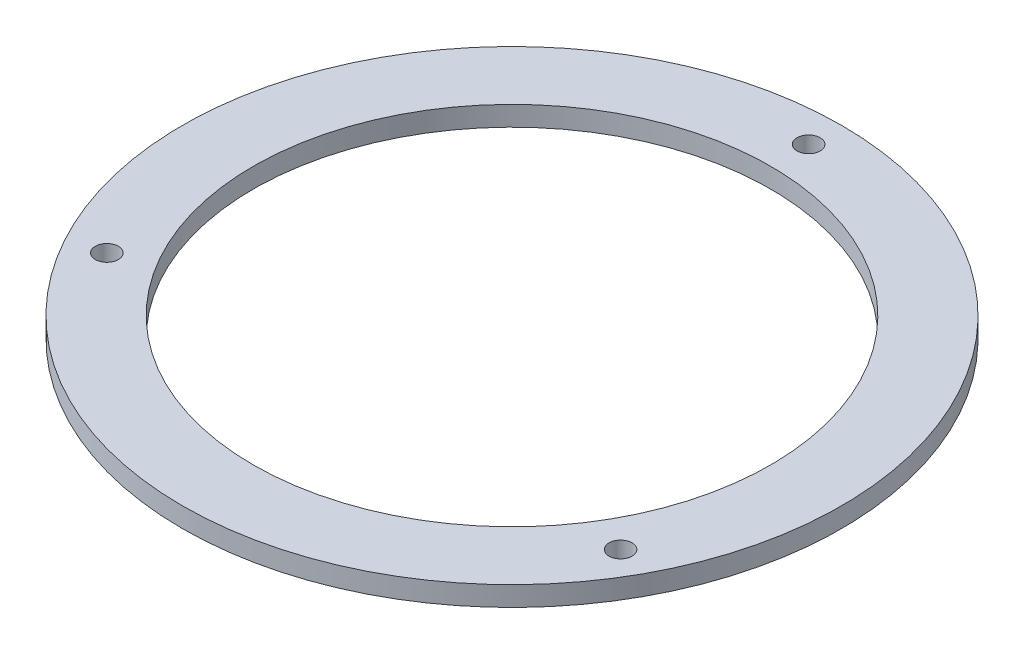
ISO-10303-21;
HEADER;
FILE_DESCRIPTION(('STEP AP214'),'2;1');
FILE_NAME('part.step','',(''),(''),'','','');
FILE_SCHEMA(('AUTOMOTIVE_DESIGN { 1 0 10303 214 1 1 1 1 }'));
ENDSEC;
DATA;
#1=APPLICATION_CONTEXT('core data for automotive mechanical design processes');
#2=APPLICATION_PROTOCOL_DEFINITION('international standard','automotive_design',2000,#1);
#3=PRODUCT_CONTEXT('',#1,'mechanical');
#4=PRODUCT('Part','Part','',(#3));
#5=PRODUCT_RELATED_PRODUCT_CATEGORY('part','',(#4));
#6=PRODUCT_DEFINITION_FORMATION('','',#4);
#7=PRODUCT_DEFINITION_CONTEXT('part definition',#1,'design');
#8=PRODUCT_DEFINITION('design','',#6,#7);
#9=PRODUCT_DEFINITION_SHAPE('','',#8);
#10=(LENGTH_UNIT() NAMED_UNIT(*) SI_UNIT(.MILLI.,.METRE.));
#11=(NAMED_UNIT(*) PLANE_ANGLE_UNIT() SI_UNIT($,.RADIAN.));
#12=(NAMED_UNIT(*) SI_UNIT($,.STERADIAN.) SOLID_ANGLE_UNIT());
#13=UNCERTAINTY_MEASURE_WITH_UNIT(LENGTH_MEASURE(1.E-05),#10,'distance_accuracy_value','');
#14=(GEOMETRIC_REPRESENTATION_CONTEXT(3) GLOBAL_UNCERTAINTY_ASSIGNED_CONTEXT((#13)) GLOBAL_UNIT_ASSIGNED_CONTEXT((#10,
#11,#12)) REPRESENTATION_CONTEXT('',''));
#15=CARTESIAN_POINT('',(0.,0.,0.));
#16=DIRECTION('',(0.,0.,1.));
#17=DIRECTION('',(1.,0.,0.));
#18=AXIS2_PLACEMENT_3D('',#15,#16,#17);
#19=CARTESIAN_POINT('',(0.,3.,0.));
#20=DIRECTION('',(0.,1.,0.));
#21=DIRECTION('',(0.,0.,1.));
#22=AXIS2_PLACEMENT_3D('',#19,#20,#21);
#23=PLANE('',#22);
#24=CARTESIAN_POINT('',(38.9711431703026,3.,22.4999999999983));
#25=DIRECTION('',(0.,1.,0.));
#26=DIRECTION('',(0.,0.,1.));
#27=AXIS2_PLACEMENT_3D('',#24,#25,#26);
#28=CIRCLE('',#27,1.75000000000246);
#29=CARTESIAN_POINT('',(38.9711431703026,3.,24.2500000000008));
#30=VERTEX_POINT('',#29);
#31=EDGE_CURVE('E53',#30,#30,#28,.T.);
#32=ORIENTED_EDGE('',*,*,#31,.F.);
#33=EDGE_LOOP('',(#32));
#34=FACE_BOUND('',#33,.T.);
#35=CARTESIAN_POINT('',(0.,3.,0.));
#36=DIRECTION('',(0.,1.,0.));
#37=DIRECTION('',(0.,0.,1.));
#38=AXIS2_PLACEMENT_3D('',#35,#36,#37);
#39=CIRCLE('',#38,39.25);
#40=CARTESIAN_POINT('',(0.,3.,39.25));
#41=VERTEX_POINT('',#40);
#42=EDGE_CURVE('E42',#41,#41,#39,.T.);
#43=ORIENTED_EDGE('',*,*,#42,.F.);
#44=EDGE_LOOP('',(#43));
#45=FACE_BOUND('',#44,.T.);
#46=CARTESIAN_POINT('',(0.,3.,0.));
#47=DIRECTION('',(0.,1.,0.));
#48=DIRECTION('',(0.,0.,1.));
#49=AXIS2_PLACEMENT_3D('',#46,#47,#48);
#50=CIRCLE('',#49,50.);
#51=CARTESIAN_POINT('',(0.,3.,50.));
#52=VERTEX_POINT('',#51);
#53=EDGE_CURVE('E10',#52,#52,#50,.T.);
#54=ORIENTED_EDGE('',*,*,#53,.T.);
#55=EDGE_LOOP('',(#54));
#56=FACE_BOUND('',#55,.T.);
#57=CARTESIAN_POINT('',(0.,3.,-45.));
#58=DIRECTION('',(0.,1.,0.));
#59=DIRECTION('',(0.,0.,1.));
#60=AXIS2_PLACEMENT_3D('',#57,#58,#59);
#61=CIRCLE('',#60,1.75);
#62=CARTESIAN_POINT('',(0.,3.,-43.25));
#63=VERTEX_POINT('',#62);
#64=EDGE_CURVE('E47',#63,#63,#61,.T.);
#65=ORIENTED_EDGE('',*,*,#64,.F.);
#66=EDGE_LOOP('',(#65));
#67=FACE_BOUND('',#66,.T.);
#68=CARTESIAN_POINT('',(-38.9711431702969,3.,22.5000000000017));
#69=DIRECTION('',(0.,1.,0.));
#70=DIRECTION('',(0.,0.,1.));
#71=AXIS2_PLACEMENT_3D('',#68,#69,#70);
#72=CIRCLE('',#71,1.75000000000364);
#73=CARTESIAN_POINT('',(-38.9711431702969,3.,24.2500000000053));
#74=VERTEX_POINT('',#73);
#75=EDGE_CURVE('E59',#74,#74,#72,.T.);
#76=ORIENTED_EDGE('',*,*,#75,.F.);
#77=EDGE_LOOP('',(#76));
#78=FACE_BOUND('',#77,.T.);
#79=ADVANCED_FACE('F31',(#34,#45,#56,#67,#78),#23,.T.);
#80=CARTESIAN_POINT('',(0.,0.,0.));
#81=DIRECTION('',(0.,1.,0.));
#82=DIRECTION('',(0.,0.,1.));
#83=AXIS2_PLACEMENT_3D('',#80,#81,#82);
#84=PLANE('',#83);
#85=CARTESIAN_POINT('',(0.,0.,0.));
#86=DIRECTION('',(0.,1.,0.));
#87=DIRECTION('',(0.,0.,1.));
#88=AXIS2_PLACEMENT_3D('',#85,#86,#87);
#89=CIRCLE('',#88,50.);
#90=CARTESIAN_POINT('',(0.,0.,50.));
#91=VERTEX_POINT('',#90);
#92=EDGE_CURVE('E35',#91,#91,#89,.T.);
#93=ORIENTED_EDGE('',*,*,#92,.F.);
#94=EDGE_LOOP('',(#93));
#95=FACE_BOUND('',#94,.T.);
#96=CARTESIAN_POINT('',(0.,0.,0.));
#97=DIRECTION('',(0.,1.,0.));
#98=DIRECTION('',(0.,0.,1.));
#99=AXIS2_PLACEMENT_3D('',#96,#97,#98);
#100=CIRCLE('',#99,39.25);
#101=CARTESIAN_POINT('',(0.,0.,39.25));
#102=VERTEX_POINT('',#101);
#103=EDGE_CURVE('E44',#102,#102,#100,.T.);
#104=ORIENTED_EDGE('',*,*,#103,.T.);
#105=EDGE_LOOP('',(#104));
#106=FACE_BOUND('',#105,.T.);
#107=CARTESIAN_POINT('',(0.,0.,-45.));
#108=DIRECTION('',(0.,1.,0.));
#109=DIRECTION('',(0.,0.,1.));
#110=AXIS2_PLACEMENT_3D('',#107,#108,#109);
#111=CIRCLE('',#110,1.75);
#112=CARTESIAN_POINT('',(0.,0.,-43.25));
#113=VERTEX_POINT('',#112);
#114=EDGE_CURVE('E50',#113,#113,#111,.T.);
#115=ORIENTED_EDGE('',*,*,#114,.T.);
#116=EDGE_LOOP('',(#115));
#117=FACE_BOUND('',#116,.T.);
#118=CARTESIAN_POINT('',(38.9711431703026,0.,22.4999999999983));
#119=DIRECTION('',(0.,1.,0.));
#120=DIRECTION('',(0.,0.,1.));
#121=AXIS2_PLACEMENT_3D('',#118,#119,#120);
#122=CIRCLE('',#121,1.75000000000246);
#123=CARTESIAN_POINT('',(38.9711431703026,0.,24.2500000000008));
#124=VERTEX_POINT('',#123);
#125=EDGE_CURVE('E56',#124,#124,#122,.T.);
#126=ORIENTED_EDGE('',*,*,#125,.T.);
#127=EDGE_LOOP('',(#126));
#128=FACE_BOUND('',#127,.T.);
#129=CARTESIAN_POINT('',(-38.9711431702969,0.,22.5000000000017));
#130=DIRECTION('',(0.,1.,0.));
#131=DIRECTION('',(0.,0.,1.));
#132=AXIS2_PLACEMENT_3D('',#129,#130,#131);
#133=CIRCLE('',#132,1.75000000000364);
#134=CARTESIAN_POINT('',(-38.9711431702969,0.,24.2500000000053));
#135=VERTEX_POINT('',#134);
#136=EDGE_CURVE('E62',#135,#135,#133,.T.);
#137=ORIENTED_EDGE('',*,*,#136,.T.);
#138=EDGE_LOOP('',(#137));
#139=FACE_BOUND('',#138,.T.);
#140=ADVANCED_FACE('F72',(#95,#106,#117,#128,#139),#84,.F.);
#141=CARTESIAN_POINT('',(0.,3.,0.));
#142=DIRECTION('',(0.,-1.,0.));
#143=DIRECTION('',(0.,0.,-1.));
#144=AXIS2_PLACEMENT_3D('',#141,#142,#143);
#145=CYLINDRICAL_SURFACE('',#144,50.);
#146=ORIENTED_EDGE('',*,*,#53,.F.);
#147=EDGE_LOOP('',(#146));
#148=FACE_BOUND('',#147,.T.);
#149=ORIENTED_EDGE('',*,*,#92,.T.);
#150=EDGE_LOOP('',(#149));
#151=FACE_BOUND('',#150,.T.);
#152=ADVANCED_FACE('F33',(#148,#151),#145,.T.);
#153=CARTESIAN_POINT('',(0.,3.,0.));
#154=DIRECTION('',(0.,-1.,0.));
#155=DIRECTION('',(0.,0.,-1.));
#156=AXIS2_PLACEMENT_3D('',#153,#154,#155);
#157=CYLINDRICAL_SURFACE('',#156,39.25);
#158=ORIENTED_EDGE('',*,*,#42,.T.);
#159=EDGE_LOOP('',(#158));
#160=FACE_BOUND('',#159,.T.);
#161=ORIENTED_EDGE('',*,*,#103,.F.);
#162=EDGE_LOOP('',(#161));
#163=FACE_BOUND('',#162,.T.);
#164=ADVANCED_FACE('F82',(#160,#163),#157,.F.);
#165=CARTESIAN_POINT('',(0.,3.,-45.));
#166=DIRECTION('',(0.,-1.,0.));
#167=DIRECTION('',(0.,0.,-1.));
#168=AXIS2_PLACEMENT_3D('',#165,#166,#167);
#169=CYLINDRICAL_SURFACE('',#168,1.75);
#170=ORIENTED_EDGE('',*,*,#64,.T.);
#171=EDGE_LOOP('',(#170));
#172=FACE_BOUND('',#171,.T.);
#173=ORIENTED_EDGE('',*,*,#114,.F.);
#174=EDGE_LOOP('',(#173));
#175=FACE_BOUND('',#174,.T.);
#176=ADVANCED_FACE('F85',(#172,#175),#169,.F.);
#177=CARTESIAN_POINT('',(38.9711431703026,3.,22.4999999999983));
#178=DIRECTION('',(0.,-1.,0.));
#179=DIRECTION('',(0.,0.,-1.));
#180=AXIS2_PLACEMENT_3D('',#177,#178,#179);
#181=CYLINDRICAL_SURFACE('',#180,1.75000000000246);
#182=ORIENTED_EDGE('',*,*,#31,.T.);
#183=EDGE_LOOP('',(#182));
#184=FACE_BOUND('',#183,.T.);
#185=ORIENTED_EDGE('',*,*,#125,.F.);
#186=EDGE_LOOP('',(#185));
#187=FACE_BOUND('',#186,.T.);
#188=ADVANCED_FACE('F89',(#184,#187),#181,.F.);
#189=CARTESIAN_POINT('',(-38.9711431702969,3.,22.5000000000017));
#190=DIRECTION('',(0.,-1.,0.));
#191=DIRECTION('',(0.,0.,-1.));
#192=AXIS2_PLACEMENT_3D('',#189,#190,#191);
#193=CYLINDRICAL_SURFACE('',#192,1.75000000000364);
#194=ORIENTED_EDGE('',*,*,#75,.T.);
#195=EDGE_LOOP('',(#194));
#196=FACE_BOUND('',#195,.T.);
#197=ORIENTED_EDGE('',*,*,#136,.F.);
#198=EDGE_LOOP('',(#197));
#199=FACE_BOUND('',#198,.T.);
#200=ADVANCED_FACE('F68',(#196,#199),#193,.F.);
#201=CLOSED_SHELL('',(#79,#140,#152,#164,#176,#188,#200));
#202=MANIFOLD_SOLID_BREP('B2',#201);
#203=ADVANCED_BREP_SHAPE_REPRESENTATION('',(#18,#202),#14);
#204=SHAPE_DEFINITION_REPRESENTATION(#9,#203);
ENDSEC;
END-ISO-10303-21;
